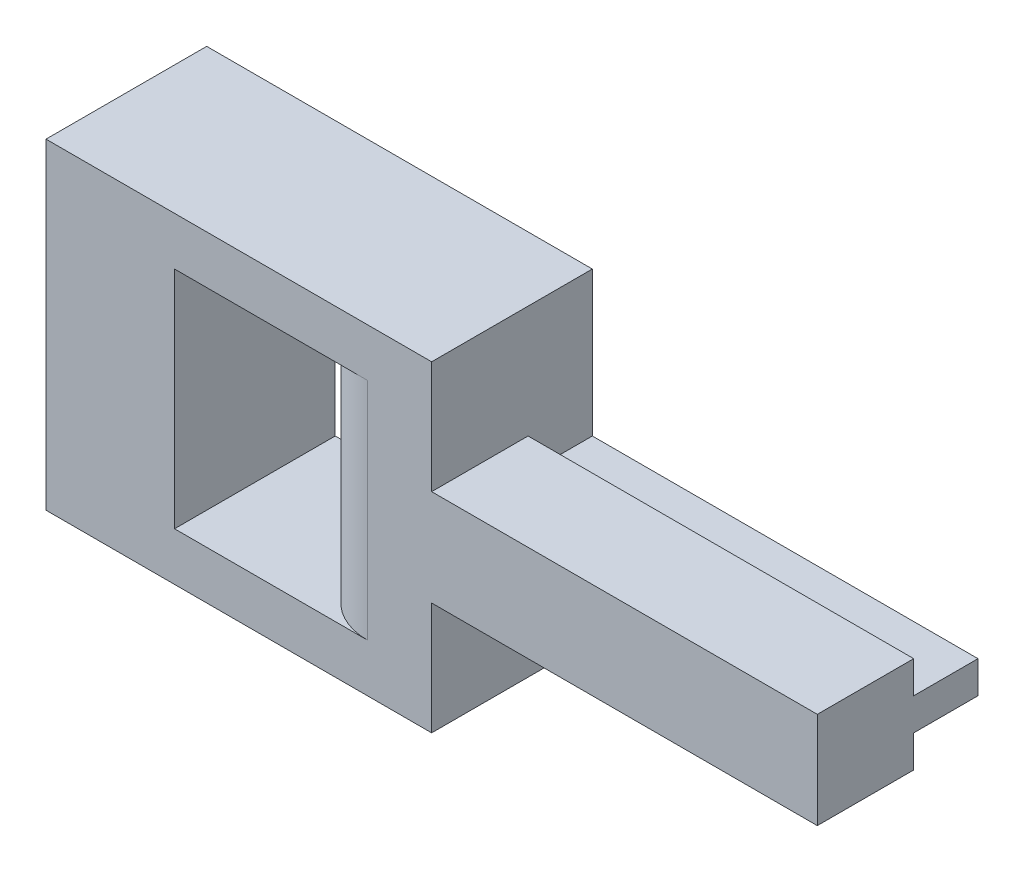
ISO-10303-21;
HEADER;
FILE_DESCRIPTION(('STEP AP214'),'2;1');
FILE_NAME('part.step','',(''),(''),'','','');
FILE_SCHEMA(('AUTOMOTIVE_DESIGN { 1 0 10303 214 1 1 1 1 }'));
ENDSEC;
DATA;
#1=APPLICATION_CONTEXT('core data for automotive mechanical design processes');
#2=APPLICATION_PROTOCOL_DEFINITION('international standard','automotive_design',2000,#1);
#3=PRODUCT_CONTEXT('',#1,'mechanical');
#4=PRODUCT('Part','Part','',(#3));
#5=PRODUCT_RELATED_PRODUCT_CATEGORY('part','',(#4));
#6=PRODUCT_DEFINITION_FORMATION('','',#4);
#7=PRODUCT_DEFINITION_CONTEXT('part definition',#1,'design');
#8=PRODUCT_DEFINITION('design','',#6,#7);
#9=PRODUCT_DEFINITION_SHAPE('','',#8);
#10=(LENGTH_UNIT() NAMED_UNIT(*) SI_UNIT(.MILLI.,.METRE.));
#11=(NAMED_UNIT(*) PLANE_ANGLE_UNIT() SI_UNIT($,.RADIAN.));
#12=(NAMED_UNIT(*) SI_UNIT($,.STERADIAN.) SOLID_ANGLE_UNIT());
#13=UNCERTAINTY_MEASURE_WITH_UNIT(LENGTH_MEASURE(1.E-05),#10,'distance_accuracy_value','');
#14=(GEOMETRIC_REPRESENTATION_CONTEXT(3) GLOBAL_UNCERTAINTY_ASSIGNED_CONTEXT((#13)) GLOBAL_UNIT_ASSIGNED_CONTEXT((#10,
#11,#12)) REPRESENTATION_CONTEXT('',''));
#15=CARTESIAN_POINT('',(0.,0.,0.));
#16=DIRECTION('',(0.,0.,1.));
#17=DIRECTION('',(1.,0.,0.));
#18=AXIS2_PLACEMENT_3D('',#15,#16,#17);
#19=CARTESIAN_POINT('',(0.,0.,0.));
#20=DIRECTION('',(0.,0.,1.));
#21=DIRECTION('',(1.,0.,0.));
#22=AXIS2_PLACEMENT_3D('',#19,#20,#21);
#23=PLANE('',#22);
#24=DIRECTION('',(0.,1.,0.));
#25=VECTOR('',#24,1.);
#26=CARTESIAN_POINT('',(8.,8.5,0.));
#27=LINE('',#26,#25);
#28=CARTESIAN_POINT('',(8.,1.5,0.));
#29=VERTEX_POINT('',#28);
#30=CARTESIAN_POINT('',(8.,8.5,0.));
#31=VERTEX_POINT('',#30);
#32=EDGE_CURVE('E197',#29,#31,#27,.T.);
#33=ORIENTED_EDGE('',*,*,#32,.T.);
#34=DIRECTION('',(-1.,0.,0.));
#35=VECTOR('',#34,1.);
#36=CARTESIAN_POINT('',(4.,8.5,0.));
#37=LINE('',#36,#35);
#38=CARTESIAN_POINT('',(4.,8.5,0.));
#39=VERTEX_POINT('',#38);
#40=EDGE_CURVE('E214',#31,#39,#37,.T.);
#41=ORIENTED_EDGE('',*,*,#40,.T.);
#42=DIRECTION('',(0.,-1.,0.));
#43=VECTOR('',#42,1.);
#44=CARTESIAN_POINT('',(4.,1.5,0.));
#45=LINE('',#44,#43);
#46=CARTESIAN_POINT('',(4.,1.5,0.));
#47=VERTEX_POINT('',#46);
#48=EDGE_CURVE('E217',#39,#47,#45,.T.);
#49=ORIENTED_EDGE('',*,*,#48,.T.);
#50=DIRECTION('',(1.,0.,0.));
#51=VECTOR('',#50,1.);
#52=CARTESIAN_POINT('',(4.,1.5,0.));
#53=LINE('',#52,#51);
#54=EDGE_CURVE('E206',#47,#29,#53,.T.);
#55=ORIENTED_EDGE('',*,*,#54,.T.);
#56=EDGE_LOOP('',(#33,#41,#49,#55));
#57=FACE_BOUND('',#56,.T.);
#58=DIRECTION('',(1.,0.,0.));
#59=VECTOR('',#58,1.);
#60=CARTESIAN_POINT('',(9.76393202250021,5.5,0.));
#61=LINE('',#60,#59);
#62=CARTESIAN_POINT('',(12.,5.5,0.));
#63=VERTEX_POINT('',#62);
#64=CARTESIAN_POINT('',(24.,5.5,0.));
#65=VERTEX_POINT('',#64);
#66=EDGE_CURVE('E155',#63,#65,#61,.T.);
#67=ORIENTED_EDGE('',*,*,#66,.T.);
#68=DIRECTION('',(0.,1.,0.));
#69=VECTOR('',#68,1.);
#70=CARTESIAN_POINT('',(24.,3.5,0.));
#71=LINE('',#70,#69);
#72=CARTESIAN_POINT('',(24.,4.5,0.));
#73=VERTEX_POINT('',#72);
#74=EDGE_CURVE('E163',#73,#65,#71,.T.);
#75=ORIENTED_EDGE('',*,*,#74,.F.);
#76=DIRECTION('',(1.,0.,0.));
#77=VECTOR('',#76,1.);
#78=CARTESIAN_POINT('',(9.76393202250021,4.5,0.));
#79=LINE('',#78,#77);
#80=CARTESIAN_POINT('',(12.,4.5,0.));
#81=VERTEX_POINT('',#80);
#82=EDGE_CURVE('E193',#81,#73,#79,.T.);
#83=ORIENTED_EDGE('',*,*,#82,.F.);
#84=DIRECTION('',(0.,1.,0.));
#85=VECTOR('',#84,1.);
#86=CARTESIAN_POINT('',(12.,0.,0.));
#87=LINE('',#86,#85);
#88=CARTESIAN_POINT('',(12.,0.,0.));
#89=VERTEX_POINT('',#88);
#90=EDGE_CURVE('E252',#89,#81,#87,.T.);
#91=ORIENTED_EDGE('',*,*,#90,.F.);
#92=DIRECTION('',(1.,0.,0.));
#93=VECTOR('',#92,1.);
#94=CARTESIAN_POINT('',(0.,0.,0.));
#95=LINE('',#94,#93);
#96=CARTESIAN_POINT('',(0.,0.,0.));
#97=VERTEX_POINT('',#96);
#98=EDGE_CURVE('E250',#97,#89,#95,.T.);
#99=ORIENTED_EDGE('',*,*,#98,.F.);
#100=DIRECTION('',(0.,-1.,0.));
#101=VECTOR('',#100,1.);
#102=CARTESIAN_POINT('',(0.,10.,0.));
#103=LINE('',#102,#101);
#104=CARTESIAN_POINT('',(0.,10.,0.));
#105=VERTEX_POINT('',#104);
#106=EDGE_CURVE('E229',#105,#97,#103,.T.);
#107=ORIENTED_EDGE('',*,*,#106,.F.);
#108=DIRECTION('',(-1.,0.,0.));
#109=VECTOR('',#108,1.);
#110=CARTESIAN_POINT('',(12.,9.99999999999999,0.));
#111=LINE('',#110,#109);
#112=CARTESIAN_POINT('',(12.,9.99999999999999,0.));
#113=VERTEX_POINT('',#112);
#114=EDGE_CURVE('E158',#113,#105,#111,.T.);
#115=ORIENTED_EDGE('',*,*,#114,.F.);
#116=DIRECTION('',(0.,1.,0.));
#117=VECTOR('',#116,1.);
#118=CARTESIAN_POINT('',(12.,6.5,0.));
#119=LINE('',#118,#117);
#120=EDGE_CURVE('E152',#63,#113,#119,.T.);
#121=ORIENTED_EDGE('',*,*,#120,.F.);
#122=EDGE_LOOP('',(#67,#75,#83,#91,#99,#107,#115,#121));
#123=FACE_BOUND('',#122,.T.);
#124=ADVANCED_FACE('F33',(#57,#123),#23,.F.);
#125=CARTESIAN_POINT('',(24.,3.5,5.));
#126=DIRECTION('',(-1.,0.,0.));
#127=DIRECTION('',(0.,0.,1.));
#128=AXIS2_PLACEMENT_3D('',#125,#126,#127);
#129=PLANE('',#128);
#130=DIRECTION('',(0.,1.,0.));
#131=VECTOR('',#130,1.);
#132=CARTESIAN_POINT('',(24.,0.,2.));
#133=LINE('',#132,#131);
#134=CARTESIAN_POINT('',(24.,5.5,2.));
#135=VERTEX_POINT('',#134);
#136=CARTESIAN_POINT('',(24.,6.5,2.));
#137=VERTEX_POINT('',#136);
#138=EDGE_CURVE('E183',#135,#137,#133,.T.);
#139=ORIENTED_EDGE('',*,*,#138,.T.);
#140=DIRECTION('',(0.,0.,-1.));
#141=VECTOR('',#140,1.);
#142=CARTESIAN_POINT('',(24.,6.5,5.));
#143=LINE('',#142,#141);
#144=CARTESIAN_POINT('',(24.,6.5,5.));
#145=VERTEX_POINT('',#144);
#146=EDGE_CURVE('E262',#145,#137,#143,.T.);
#147=ORIENTED_EDGE('',*,*,#146,.F.);
#148=DIRECTION('',(0.,1.,0.));
#149=VECTOR('',#148,1.);
#150=CARTESIAN_POINT('',(24.,3.5,5.));
#151=LINE('',#150,#149);
#152=CARTESIAN_POINT('',(24.,3.5,5.));
#153=VERTEX_POINT('',#152);
#154=EDGE_CURVE('E239',#153,#145,#151,.T.);
#155=ORIENTED_EDGE('',*,*,#154,.F.);
#156=DIRECTION('',(0.,0.,-1.));
#157=VECTOR('',#156,1.);
#158=CARTESIAN_POINT('',(24.,3.5,5.));
#159=LINE('',#158,#157);
#160=CARTESIAN_POINT('',(24.,3.5,2.));
#161=VERTEX_POINT('',#160);
#162=EDGE_CURVE('E265',#153,#161,#159,.T.);
#163=ORIENTED_EDGE('',*,*,#162,.T.);
#164=DIRECTION('',(0.,1.,0.));
#165=VECTOR('',#164,1.);
#166=CARTESIAN_POINT('',(24.,0.,2.));
#167=LINE('',#166,#165);
#168=CARTESIAN_POINT('',(24.,4.5,2.));
#169=VERTEX_POINT('',#168);
#170=EDGE_CURVE('E187',#161,#169,#167,.T.);
#171=ORIENTED_EDGE('',*,*,#170,.T.);
#172=DIRECTION('',(0.,0.,-1.));
#173=VECTOR('',#172,1.);
#174=CARTESIAN_POINT('',(24.,4.5,0.));
#175=LINE('',#174,#173);
#176=EDGE_CURVE('E48',#169,#73,#175,.T.);
#177=ORIENTED_EDGE('',*,*,#176,.T.);
#178=ORIENTED_EDGE('',*,*,#74,.T.);
#179=DIRECTION('',(0.,0.,1.));
#180=VECTOR('',#179,1.);
#181=CARTESIAN_POINT('',(24.,5.5,0.));
#182=LINE('',#181,#180);
#183=EDGE_CURVE('E170',#65,#135,#182,.T.);
#184=ORIENTED_EDGE('',*,*,#183,.T.);
#185=EDGE_LOOP('',(#139,#147,#155,#163,#171,#177,#178,#184));
#186=FACE_BOUND('',#185,.T.);
#187=ADVANCED_FACE('F315',(#186),#129,.F.);
#188=CARTESIAN_POINT('',(12.,6.5,5.));
#189=DIRECTION('',(0.,-1.,0.));
#190=DIRECTION('',(1.,0.,0.));
#191=AXIS2_PLACEMENT_3D('',#188,#189,#190);
#192=PLANE('',#191);
#193=DIRECTION('',(1.,0.,0.));
#194=VECTOR('',#193,1.);
#195=CARTESIAN_POINT('',(9.76393202250021,6.5,2.));
#196=LINE('',#195,#194);
#197=CARTESIAN_POINT('',(12.,6.5,2.));
#198=VERTEX_POINT('',#197);
#199=EDGE_CURVE('E171',#198,#137,#196,.T.);
#200=ORIENTED_EDGE('',*,*,#199,.F.);
#201=DIRECTION('',(0.,0.,-1.));
#202=VECTOR('',#201,1.);
#203=CARTESIAN_POINT('',(12.,6.5,5.));
#204=LINE('',#203,#202);
#205=CARTESIAN_POINT('',(12.,6.5,5.));
#206=VERTEX_POINT('',#205);
#207=EDGE_CURVE('E260',#206,#198,#204,.T.);
#208=ORIENTED_EDGE('',*,*,#207,.F.);
#209=DIRECTION('',(-1.,0.,0.));
#210=VECTOR('',#209,1.);
#211=CARTESIAN_POINT('',(12.,6.5,5.));
#212=LINE('',#211,#210);
#213=EDGE_CURVE('E241',#145,#206,#212,.T.);
#214=ORIENTED_EDGE('',*,*,#213,.F.);
#215=ORIENTED_EDGE('',*,*,#146,.T.);
#216=EDGE_LOOP('',(#200,#208,#214,#215));
#217=FACE_BOUND('',#216,.T.);
#218=ADVANCED_FACE('F320',(#217),#192,.F.);
#219=CARTESIAN_POINT('',(12.,3.5,5.));
#220=DIRECTION('',(0.,1.,0.));
#221=DIRECTION('',(-1.,0.,0.));
#222=AXIS2_PLACEMENT_3D('',#219,#220,#221);
#223=PLANE('',#222);
#224=DIRECTION('',(1.,0.,0.));
#225=VECTOR('',#224,1.);
#226=CARTESIAN_POINT('',(9.76393202250021,3.5,2.));
#227=LINE('',#226,#225);
#228=CARTESIAN_POINT('',(12.,3.5,2.));
#229=VERTEX_POINT('',#228);
#230=EDGE_CURVE('E191',#229,#161,#227,.T.);
#231=ORIENTED_EDGE('',*,*,#230,.T.);
#232=ORIENTED_EDGE('',*,*,#162,.F.);
#233=DIRECTION('',(1.,0.,0.));
#234=VECTOR('',#233,1.);
#235=CARTESIAN_POINT('',(12.,3.5,5.));
#236=LINE('',#235,#234);
#237=CARTESIAN_POINT('',(12.,3.5,5.));
#238=VERTEX_POINT('',#237);
#239=EDGE_CURVE('E237',#238,#153,#236,.T.);
#240=ORIENTED_EDGE('',*,*,#239,.F.);
#241=DIRECTION('',(0.,0.,-1.));
#242=VECTOR('',#241,1.);
#243=CARTESIAN_POINT('',(12.,3.5,5.));
#244=LINE('',#243,#242);
#245=EDGE_CURVE('E268',#238,#229,#244,.T.);
#246=ORIENTED_EDGE('',*,*,#245,.T.);
#247=EDGE_LOOP('',(#231,#232,#240,#246));
#248=FACE_BOUND('',#247,.T.);
#249=ADVANCED_FACE('F328',(#248),#223,.F.);
#250=CARTESIAN_POINT('',(0.,0.,5.));
#251=DIRECTION('',(0.,0.,1.));
#252=DIRECTION('',(1.,0.,0.));
#253=AXIS2_PLACEMENT_3D('',#250,#251,#252);
#254=PLANE('',#253);
#255=DIRECTION('',(0.,-1.,0.));
#256=VECTOR('',#255,1.);
#257=CARTESIAN_POINT('',(0.,10.,5.));
#258=LINE('',#257,#256);
#259=CARTESIAN_POINT('',(0.,10.,5.));
#260=VERTEX_POINT('',#259);
#261=CARTESIAN_POINT('',(0.,0.,5.));
#262=VERTEX_POINT('',#261);
#263=EDGE_CURVE('E230',#260,#262,#258,.T.);
#264=ORIENTED_EDGE('',*,*,#263,.T.);
#265=DIRECTION('',(1.,0.,0.));
#266=VECTOR('',#265,1.);
#267=CARTESIAN_POINT('',(0.,0.,5.));
#268=LINE('',#267,#266);
#269=CARTESIAN_POINT('',(12.,0.,5.));
#270=VERTEX_POINT('',#269);
#271=EDGE_CURVE('E233',#262,#270,#268,.T.);
#272=ORIENTED_EDGE('',*,*,#271,.T.);
#273=DIRECTION('',(0.,1.,0.));
#274=VECTOR('',#273,1.);
#275=CARTESIAN_POINT('',(12.,0.,5.));
#276=LINE('',#275,#274);
#277=EDGE_CURVE('E235',#270,#238,#276,.T.);
#278=ORIENTED_EDGE('',*,*,#277,.T.);
#279=ORIENTED_EDGE('',*,*,#239,.T.);
#280=ORIENTED_EDGE('',*,*,#154,.T.);
#281=ORIENTED_EDGE('',*,*,#213,.T.);
#282=DIRECTION('',(0.,1.,0.));
#283=VECTOR('',#282,1.);
#284=CARTESIAN_POINT('',(12.,6.5,5.));
#285=LINE('',#284,#283);
#286=CARTESIAN_POINT('',(12.,9.99999999999999,5.));
#287=VERTEX_POINT('',#286);
#288=EDGE_CURVE('E243',#206,#287,#285,.T.);
#289=ORIENTED_EDGE('',*,*,#288,.T.);
#290=DIRECTION('',(-1.,0.,0.));
#291=VECTOR('',#290,1.);
#292=CARTESIAN_POINT('',(12.,9.99999999999999,5.));
#293=LINE('',#292,#291);
#294=EDGE_CURVE('E245',#287,#260,#293,.T.);
#295=ORIENTED_EDGE('',*,*,#294,.T.);
#296=EDGE_LOOP('',(#264,#272,#278,#279,#280,#281,#289,#295));
#297=FACE_BOUND('',#296,.T.);
#298=DIRECTION('',(-1.,0.,0.));
#299=VECTOR('',#298,1.);
#300=CARTESIAN_POINT('',(4.,8.5,5.));
#301=LINE('',#300,#299);
#302=CARTESIAN_POINT('',(10.,8.5,5.));
#303=VERTEX_POINT('',#302);
#304=CARTESIAN_POINT('',(4.,8.5,5.));
#305=VERTEX_POINT('',#304);
#306=EDGE_CURVE('E56',#303,#305,#301,.T.);
#307=ORIENTED_EDGE('',*,*,#306,.F.);
#308=DIRECTION('',(0.,1.,0.));
#309=VECTOR('',#308,1.);
#310=CARTESIAN_POINT('',(10.,0.,5.));
#311=LINE('',#310,#309);
#312=CARTESIAN_POINT('',(10.,1.5,5.));
#313=VERTEX_POINT('',#312);
#314=EDGE_CURVE('E280',#303,#313,#311,.F.);
#315=ORIENTED_EDGE('',*,*,#314,.T.);
#316=DIRECTION('',(1.,0.,0.));
#317=VECTOR('',#316,1.);
#318=CARTESIAN_POINT('',(4.,1.5,5.));
#319=LINE('',#318,#317);
#320=CARTESIAN_POINT('',(4.,1.5,5.));
#321=VERTEX_POINT('',#320);
#322=EDGE_CURVE('E209',#321,#313,#319,.T.);
#323=ORIENTED_EDGE('',*,*,#322,.F.);
#324=DIRECTION('',(0.,-1.,0.));
#325=VECTOR('',#324,1.);
#326=CARTESIAN_POINT('',(4.,1.5,5.));
#327=LINE('',#326,#325);
#328=EDGE_CURVE('E205',#305,#321,#327,.T.);
#329=ORIENTED_EDGE('',*,*,#328,.F.);
#330=EDGE_LOOP('',(#307,#315,#323,#329));
#331=FACE_BOUND('',#330,.T.);
#332=ADVANCED_FACE('F291',(#297,#331),#254,.T.);
#333=CARTESIAN_POINT('',(0.,10.,5.));
#334=DIRECTION('',(1.,0.,0.));
#335=DIRECTION('',(0.,1.,0.));
#336=AXIS2_PLACEMENT_3D('',#333,#334,#335);
#337=PLANE('',#336);
#338=ORIENTED_EDGE('',*,*,#106,.T.);
#339=DIRECTION('',(0.,0.,-1.));
#340=VECTOR('',#339,1.);
#341=CARTESIAN_POINT('',(0.,0.,5.));
#342=LINE('',#341,#340);
#343=EDGE_CURVE('E274',#262,#97,#342,.T.);
#344=ORIENTED_EDGE('',*,*,#343,.F.);
#345=ORIENTED_EDGE('',*,*,#263,.F.);
#346=DIRECTION('',(0.,0.,-1.));
#347=VECTOR('',#346,1.);
#348=CARTESIAN_POINT('',(0.,10.,5.));
#349=LINE('',#348,#347);
#350=EDGE_CURVE('E247',#260,#105,#349,.T.);
#351=ORIENTED_EDGE('',*,*,#350,.T.);
#352=EDGE_LOOP('',(#338,#344,#345,#351));
#353=FACE_BOUND('',#352,.T.);
#354=ADVANCED_FACE('F339',(#353),#337,.F.);
#355=CARTESIAN_POINT('',(0.,0.,5.));
#356=DIRECTION('',(0.,1.,0.));
#357=DIRECTION('',(0.,0.,1.));
#358=AXIS2_PLACEMENT_3D('',#355,#356,#357);
#359=PLANE('',#358);
#360=ORIENTED_EDGE('',*,*,#98,.T.);
#361=DIRECTION('',(0.,0.,-1.));
#362=VECTOR('',#361,1.);
#363=CARTESIAN_POINT('',(12.,0.,5.));
#364=LINE('',#363,#362);
#365=EDGE_CURVE('E271',#270,#89,#364,.T.);
#366=ORIENTED_EDGE('',*,*,#365,.F.);
#367=ORIENTED_EDGE('',*,*,#271,.F.);
#368=ORIENTED_EDGE('',*,*,#343,.T.);
#369=EDGE_LOOP('',(#360,#366,#367,#368));
#370=FACE_BOUND('',#369,.T.);
#371=ADVANCED_FACE('F336',(#370),#359,.F.);
#372=CARTESIAN_POINT('',(12.,0.,5.));
#373=DIRECTION('',(-1.,0.,0.));
#374=DIRECTION('',(0.,0.,1.));
#375=AXIS2_PLACEMENT_3D('',#372,#373,#374);
#376=PLANE('',#375);
#377=ORIENTED_EDGE('',*,*,#90,.T.);
#378=DIRECTION('',(0.,0.,-1.));
#379=VECTOR('',#378,1.);
#380=CARTESIAN_POINT('',(12.,4.5,0.));
#381=LINE('',#380,#379);
#382=CARTESIAN_POINT('',(12.,4.5,2.));
#383=VERTEX_POINT('',#382);
#384=EDGE_CURVE('E194',#383,#81,#381,.T.);
#385=ORIENTED_EDGE('',*,*,#384,.F.);
#386=DIRECTION('',(0.,1.,0.));
#387=VECTOR('',#386,1.);
#388=CARTESIAN_POINT('',(12.,0.,2.));
#389=LINE('',#388,#387);
#390=EDGE_CURVE('E190',#229,#383,#389,.T.);
#391=ORIENTED_EDGE('',*,*,#390,.F.);
#392=ORIENTED_EDGE('',*,*,#245,.F.);
#393=ORIENTED_EDGE('',*,*,#277,.F.);
#394=ORIENTED_EDGE('',*,*,#365,.T.);
#395=EDGE_LOOP('',(#377,#385,#391,#392,#393,#394));
#396=FACE_BOUND('',#395,.T.);
#397=ADVANCED_FACE('F326',(#396),#376,.F.);
#398=CARTESIAN_POINT('',(12.,6.5,5.));
#399=DIRECTION('',(-1.,0.,0.));
#400=DIRECTION('',(0.,-1.,0.));
#401=AXIS2_PLACEMENT_3D('',#398,#399,#400);
#402=PLANE('',#401);
#403=ORIENTED_EDGE('',*,*,#120,.T.);
#404=DIRECTION('',(0.,0.,-1.));
#405=VECTOR('',#404,1.);
#406=CARTESIAN_POINT('',(12.,9.99999999999999,5.));
#407=LINE('',#406,#405);
#408=EDGE_CURVE('E258',#287,#113,#407,.T.);
#409=ORIENTED_EDGE('',*,*,#408,.F.);
#410=ORIENTED_EDGE('',*,*,#288,.F.);
#411=ORIENTED_EDGE('',*,*,#207,.T.);
#412=DIRECTION('',(0.,1.,0.));
#413=VECTOR('',#412,1.);
#414=CARTESIAN_POINT('',(12.,0.,2.));
#415=LINE('',#414,#413);
#416=CARTESIAN_POINT('',(12.,5.5,2.));
#417=VERTEX_POINT('',#416);
#418=EDGE_CURVE('E176',#417,#198,#415,.T.);
#419=ORIENTED_EDGE('',*,*,#418,.F.);
#420=DIRECTION('',(0.,0.,1.));
#421=VECTOR('',#420,1.);
#422=CARTESIAN_POINT('',(12.,5.5,0.));
#423=LINE('',#422,#421);
#424=EDGE_CURVE('E168',#63,#417,#423,.T.);
#425=ORIENTED_EDGE('',*,*,#424,.F.);
#426=EDGE_LOOP('',(#403,#409,#410,#411,#419,#425));
#427=FACE_BOUND('',#426,.T.);
#428=ADVANCED_FACE('F174',(#427),#402,.F.);
#429=CARTESIAN_POINT('',(12.,9.99999999999999,5.));
#430=DIRECTION('',(0.,-1.,0.));
#431=DIRECTION('',(1.,0.,0.));
#432=AXIS2_PLACEMENT_3D('',#429,#430,#431);
#433=PLANE('',#432);
#434=ORIENTED_EDGE('',*,*,#114,.T.);
#435=ORIENTED_EDGE('',*,*,#350,.F.);
#436=ORIENTED_EDGE('',*,*,#294,.F.);
#437=ORIENTED_EDGE('',*,*,#408,.T.);
#438=EDGE_LOOP('',(#434,#435,#436,#437));
#439=FACE_BOUND('',#438,.T.);
#440=ADVANCED_FACE('F304',(#439),#433,.F.);
#441=CARTESIAN_POINT('',(8.,8.5,5.));
#442=DIRECTION('',(-1.,0.,0.));
#443=DIRECTION('',(0.,0.,1.));
#444=AXIS2_PLACEMENT_3D('',#441,#442,#443);
#445=PLANE('',#444);
#446=DIRECTION('',(0.,0.,-1.));
#447=VECTOR('',#446,1.);
#448=CARTESIAN_POINT('',(8.,1.5,5.));
#449=LINE('',#448,#447);
#450=CARTESIAN_POINT('',(8.,1.5,3.));
#451=VERTEX_POINT('',#450);
#452=EDGE_CURVE('E211',#451,#29,#449,.T.);
#453=ORIENTED_EDGE('',*,*,#452,.F.);
#454=DIRECTION('',(0.,1.,0.));
#455=VECTOR('',#454,1.);
#456=CARTESIAN_POINT('',(8.,8.5,3.));
#457=LINE('',#456,#455);
#458=CARTESIAN_POINT('',(8.,8.5,3.));
#459=VERTEX_POINT('',#458);
#460=EDGE_CURVE('E277',#451,#459,#457,.T.);
#461=ORIENTED_EDGE('',*,*,#460,.T.);
#462=DIRECTION('',(0.,0.,-1.));
#463=VECTOR('',#462,1.);
#464=CARTESIAN_POINT('',(8.,8.5,5.));
#465=LINE('',#464,#463);
#466=EDGE_CURVE('E227',#459,#31,#465,.T.);
#467=ORIENTED_EDGE('',*,*,#466,.T.);
#468=ORIENTED_EDGE('',*,*,#32,.F.);
#469=EDGE_LOOP('',(#453,#461,#467,#468));
#470=FACE_BOUND('',#469,.T.);
#471=ADVANCED_FACE('F302',(#470),#445,.T.);
#472=CARTESIAN_POINT('',(4.,8.5,5.));
#473=DIRECTION('',(0.,-1.,0.));
#474=DIRECTION('',(1.,0.,0.));
#475=AXIS2_PLACEMENT_3D('',#472,#473,#474);
#476=PLANE('',#475);
#477=ORIENTED_EDGE('',*,*,#40,.F.);
#478=ORIENTED_EDGE('',*,*,#466,.F.);
#479=CARTESIAN_POINT('',(10.,8.5,3.));
#480=DIRECTION('',(0.,-1.,0.));
#481=DIRECTION('',(1.,0.,0.));
#482=AXIS2_PLACEMENT_3D('',#479,#480,#481);
#483=CIRCLE('',#482,2.);
#484=EDGE_CURVE('E41',#459,#303,#483,.F.);
#485=ORIENTED_EDGE('',*,*,#484,.T.);
#486=ORIENTED_EDGE('',*,*,#306,.T.);
#487=DIRECTION('',(0.,0.,-1.));
#488=VECTOR('',#487,1.);
#489=CARTESIAN_POINT('',(4.,8.5,5.));
#490=LINE('',#489,#488);
#491=EDGE_CURVE('E225',#305,#39,#490,.T.);
#492=ORIENTED_EDGE('',*,*,#491,.T.);
#493=EDGE_LOOP('',(#477,#478,#485,#486,#492));
#494=FACE_BOUND('',#493,.T.);
#495=ADVANCED_FACE('F285',(#494),#476,.T.);
#496=CARTESIAN_POINT('',(4.,1.5,5.));
#497=DIRECTION('',(1.,0.,0.));
#498=DIRECTION('',(0.,0.,-1.));
#499=AXIS2_PLACEMENT_3D('',#496,#497,#498);
#500=PLANE('',#499);
#501=ORIENTED_EDGE('',*,*,#48,.F.);
#502=ORIENTED_EDGE('',*,*,#491,.F.);
#503=ORIENTED_EDGE('',*,*,#328,.T.);
#504=DIRECTION('',(0.,0.,-1.));
#505=VECTOR('',#504,1.);
#506=CARTESIAN_POINT('',(4.,1.5,5.));
#507=LINE('',#506,#505);
#508=EDGE_CURVE('E223',#321,#47,#507,.T.);
#509=ORIENTED_EDGE('',*,*,#508,.T.);
#510=EDGE_LOOP('',(#501,#502,#503,#509));
#511=FACE_BOUND('',#510,.T.);
#512=ADVANCED_FACE('F298',(#511),#500,.T.);
#513=CARTESIAN_POINT('',(4.,1.5,5.));
#514=DIRECTION('',(0.,1.,0.));
#515=DIRECTION('',(-1.,0.,0.));
#516=AXIS2_PLACEMENT_3D('',#513,#514,#515);
#517=PLANE('',#516);
#518=ORIENTED_EDGE('',*,*,#54,.F.);
#519=ORIENTED_EDGE('',*,*,#508,.F.);
#520=ORIENTED_EDGE('',*,*,#322,.T.);
#521=CARTESIAN_POINT('',(10.,1.5,3.));
#522=DIRECTION('',(0.,1.,0.));
#523=DIRECTION('',(-1.,0.,0.));
#524=AXIS2_PLACEMENT_3D('',#521,#522,#523);
#525=CIRCLE('',#524,2.);
#526=EDGE_CURVE('E11',#313,#451,#525,.F.);
#527=ORIENTED_EDGE('',*,*,#526,.T.);
#528=ORIENTED_EDGE('',*,*,#452,.T.);
#529=EDGE_LOOP('',(#518,#519,#520,#527,#528));
#530=FACE_BOUND('',#529,.T.);
#531=ADVANCED_FACE('F294',(#530),#517,.T.);
#532=CARTESIAN_POINT('',(10.,8.5,3.));
#533=DIRECTION('',(0.,1.,0.));
#534=DIRECTION('',(0.,0.,1.));
#535=AXIS2_PLACEMENT_3D('',#532,#533,#534);
#536=CYLINDRICAL_SURFACE('',#535,2.);
#537=ORIENTED_EDGE('',*,*,#526,.F.);
#538=ORIENTED_EDGE('',*,*,#314,.F.);
#539=ORIENTED_EDGE('',*,*,#484,.F.);
#540=ORIENTED_EDGE('',*,*,#460,.F.);
#541=EDGE_LOOP('',(#537,#538,#539,#540));
#542=FACE_BOUND('',#541,.T.);
#543=ADVANCED_FACE('F35',(#542),#536,.T.);
#544=CARTESIAN_POINT('',(9.76393202250021,4.5,0.));
#545=DIRECTION('',(0.,-1.,0.));
#546=DIRECTION('',(0.,0.,-1.));
#547=AXIS2_PLACEMENT_3D('',#544,#545,#546);
#548=PLANE('',#547);
#549=ORIENTED_EDGE('',*,*,#384,.T.);
#550=ORIENTED_EDGE('',*,*,#82,.T.);
#551=ORIENTED_EDGE('',*,*,#176,.F.);
#552=DIRECTION('',(1.,0.,0.));
#553=VECTOR('',#552,1.);
#554=CARTESIAN_POINT('',(9.76393202250021,4.5,2.));
#555=LINE('',#554,#553);
#556=EDGE_CURVE('E178',#383,#169,#555,.T.);
#557=ORIENTED_EDGE('',*,*,#556,.F.);
#558=EDGE_LOOP('',(#549,#550,#551,#557));
#559=FACE_BOUND('',#558,.T.);
#560=ADVANCED_FACE('F365',(#559),#548,.T.);
#561=CARTESIAN_POINT('',(9.76393202250021,0.,2.));
#562=DIRECTION('',(0.,0.,-1.));
#563=DIRECTION('',(-1.,0.,0.));
#564=AXIS2_PLACEMENT_3D('',#561,#562,#563);
#565=PLANE('',#564);
#566=ORIENTED_EDGE('',*,*,#390,.T.);
#567=ORIENTED_EDGE('',*,*,#556,.T.);
#568=ORIENTED_EDGE('',*,*,#170,.F.);
#569=ORIENTED_EDGE('',*,*,#230,.F.);
#570=EDGE_LOOP('',(#566,#567,#568,#569));
#571=FACE_BOUND('',#570,.T.);
#572=ADVANCED_FACE('F370',(#571),#565,.T.);
#573=CARTESIAN_POINT('',(9.76393202250021,0.,2.));
#574=DIRECTION('',(0.,0.,-1.));
#575=DIRECTION('',(0.,1.,0.));
#576=AXIS2_PLACEMENT_3D('',#573,#574,#575);
#577=PLANE('',#576);
#578=ORIENTED_EDGE('',*,*,#418,.T.);
#579=ORIENTED_EDGE('',*,*,#199,.T.);
#580=ORIENTED_EDGE('',*,*,#138,.F.);
#581=DIRECTION('',(1.,0.,0.));
#582=VECTOR('',#581,1.);
#583=CARTESIAN_POINT('',(9.76393202250021,5.5,2.));
#584=LINE('',#583,#582);
#585=EDGE_CURVE('E185',#417,#135,#584,.T.);
#586=ORIENTED_EDGE('',*,*,#585,.F.);
#587=EDGE_LOOP('',(#578,#579,#580,#586));
#588=FACE_BOUND('',#587,.T.);
#589=ADVANCED_FACE('F363',(#588),#577,.T.);
#590=CARTESIAN_POINT('',(9.76393202250021,5.5,0.));
#591=DIRECTION('',(0.,1.,0.));
#592=DIRECTION('',(0.,0.,1.));
#593=AXIS2_PLACEMENT_3D('',#590,#591,#592);
#594=PLANE('',#593);
#595=ORIENTED_EDGE('',*,*,#424,.T.);
#596=ORIENTED_EDGE('',*,*,#585,.T.);
#597=ORIENTED_EDGE('',*,*,#183,.F.);
#598=ORIENTED_EDGE('',*,*,#66,.F.);
#599=EDGE_LOOP('',(#595,#596,#597,#598));
#600=FACE_BOUND('',#599,.T.);
#601=ADVANCED_FACE('F167',(#600),#594,.T.);
#602=CLOSED_SHELL('',(#124,#187,#218,#249,#332,#354,#371,#397,#428,#440,#471,#495,#512,#531,
#543,#560,#572,#589,#601));
#603=MANIFOLD_SOLID_BREP('B2',#602);
#604=ADVANCED_BREP_SHAPE_REPRESENTATION('',(#18,#603),#14);
#605=SHAPE_DEFINITION_REPRESENTATION(#9,#604);
ENDSEC;
END-ISO-10303-21;
